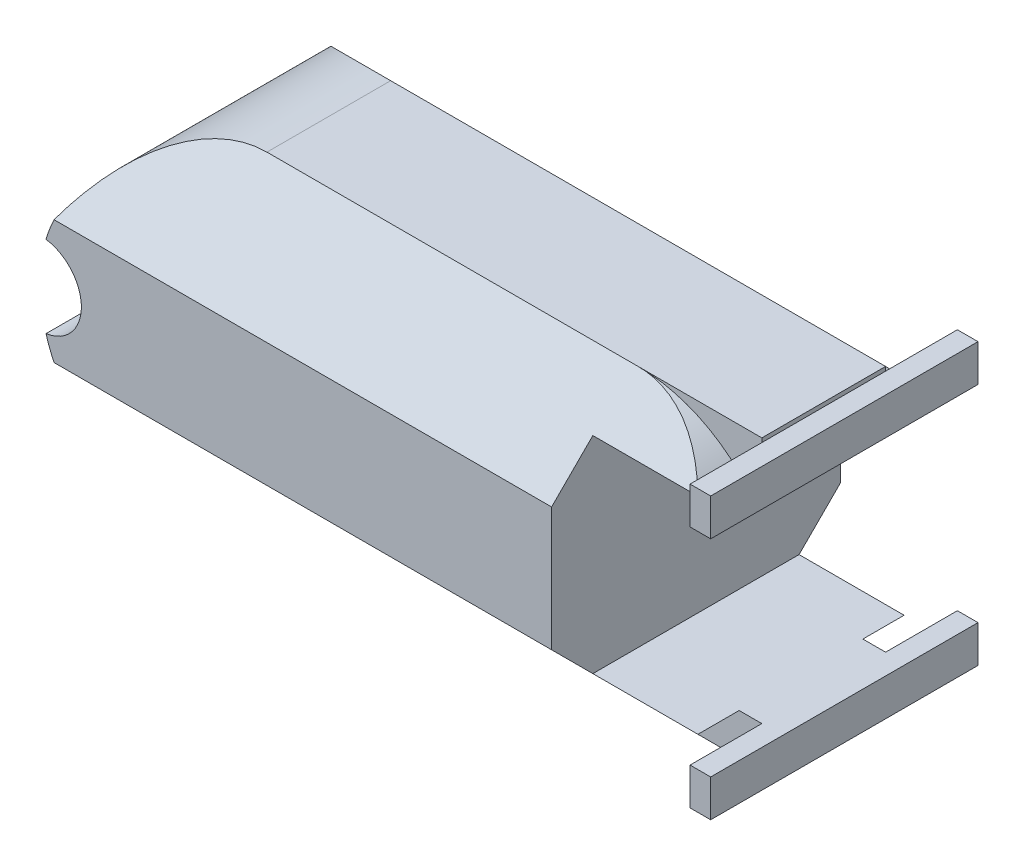
ISO-10303-21;
HEADER;
FILE_DESCRIPTION(('STEP AP214'),'2;1');
FILE_NAME('part.step','',(''),(''),'','','');
FILE_SCHEMA(('AUTOMOTIVE_DESIGN { 1 0 10303 214 1 1 1 1 }'));
ENDSEC;
DATA;
#1=APPLICATION_CONTEXT('core data for automotive mechanical design processes');
#2=APPLICATION_PROTOCOL_DEFINITION('international standard','automotive_design',2000,#1);
#3=PRODUCT_CONTEXT('',#1,'mechanical');
#4=PRODUCT('Part','Part','',(#3));
#5=PRODUCT_RELATED_PRODUCT_CATEGORY('part','',(#4));
#6=PRODUCT_DEFINITION_FORMATION('','',#4);
#7=PRODUCT_DEFINITION_CONTEXT('part definition',#1,'design');
#8=PRODUCT_DEFINITION('design','',#6,#7);
#9=PRODUCT_DEFINITION_SHAPE('','',#8);
#10=(LENGTH_UNIT() NAMED_UNIT(*) SI_UNIT(.MILLI.,.METRE.));
#11=(NAMED_UNIT(*) PLANE_ANGLE_UNIT() SI_UNIT($,.RADIAN.));
#12=(NAMED_UNIT(*) SI_UNIT($,.STERADIAN.) SOLID_ANGLE_UNIT());
#13=UNCERTAINTY_MEASURE_WITH_UNIT(LENGTH_MEASURE(1.E-05),#10,'distance_accuracy_value','');
#14=(GEOMETRIC_REPRESENTATION_CONTEXT(3) GLOBAL_UNCERTAINTY_ASSIGNED_CONTEXT((#13)) GLOBAL_UNIT_ASSIGNED_CONTEXT((#10,
#11,#12)) REPRESENTATION_CONTEXT('',''));
#15=CARTESIAN_POINT('',(0.,0.,0.));
#16=DIRECTION('',(0.,0.,1.));
#17=DIRECTION('',(1.,0.,0.));
#18=AXIS2_PLACEMENT_3D('',#15,#16,#17);
#19=CARTESIAN_POINT('',(0.,0.,35.));
#20=DIRECTION('',(0.,0.,1.));
#21=DIRECTION('',(1.,0.,0.));
#22=AXIS2_PLACEMENT_3D('',#19,#20,#21);
#23=PLANE('',#22);
#24=DIRECTION('',(1.,0.,0.));
#25=VECTOR('',#24,1.);
#26=CARTESIAN_POINT('',(22.5,-7.50000000000001,35.));
#27=LINE('',#26,#25);
#28=CARTESIAN_POINT('',(-38.3113883008419,-7.50000000000001,35.));
#29=VERTEX_POINT('',#28);
#30=CARTESIAN_POINT('',(22.0105159814593,-7.50000000000001,35.));
#31=VERTEX_POINT('',#30);
#32=EDGE_CURVE('E530',#29,#31,#27,.T.);
#33=ORIENTED_EDGE('',*,*,#32,.T.);
#34=DIRECTION('',(0.,-1.,0.));
#35=VECTOR('',#34,1.);
#36=CARTESIAN_POINT('',(22.0105159814593,12.5,35.));
#37=LINE('',#36,#35);
#38=CARTESIAN_POINT('',(22.0105159814593,7.49999999999999,35.));
#39=VERTEX_POINT('',#38);
#40=EDGE_CURVE('E408',#39,#31,#37,.T.);
#41=ORIENTED_EDGE('',*,*,#40,.F.);
#42=DIRECTION('',(-1.,0.,0.));
#43=VECTOR('',#42,1.);
#44=CARTESIAN_POINT('',(-22.5,7.49999999999999,35.));
#45=LINE('',#44,#43);
#46=CARTESIAN_POINT('',(-38.3113883008419,7.49999999999999,35.));
#47=VERTEX_POINT('',#46);
#48=EDGE_CURVE('E528',#39,#47,#45,.T.);
#49=ORIENTED_EDGE('',*,*,#48,.T.);
#50=CARTESIAN_POINT('',(-22.5,0.,35.));
#51=DIRECTION('',(0.,0.,1.));
#52=DIRECTION('',(1.,0.,0.));
#53=AXIS2_PLACEMENT_3D('',#50,#51,#52);
#54=CIRCLE('',#53,17.5);
#55=CARTESIAN_POINT('',(-39.2857142857143,4.94871659305392,35.));
#56=VERTEX_POINT('',#55);
#57=EDGE_CURVE('E543',#47,#56,#54,.T.);
#58=ORIENTED_EDGE('',*,*,#57,.T.);
#59=CARTESIAN_POINT('',(-40.,0.,35.));
#60=DIRECTION('',(0.,0.,1.));
#61=DIRECTION('',(1.,0.,0.));
#62=AXIS2_PLACEMENT_3D('',#59,#60,#61);
#63=CIRCLE('',#62,5.);
#64=CARTESIAN_POINT('',(-39.2857142857143,-4.94871659305394,35.));
#65=VERTEX_POINT('',#64);
#66=EDGE_CURVE('E554',#65,#56,#63,.T.);
#67=ORIENTED_EDGE('',*,*,#66,.F.);
#68=CARTESIAN_POINT('',(-22.5,0.,35.));
#69=DIRECTION('',(0.,0.,1.));
#70=DIRECTION('',(1.,0.,0.));
#71=AXIS2_PLACEMENT_3D('',#68,#69,#70);
#72=CIRCLE('',#71,17.5);
#73=EDGE_CURVE('E535',#65,#29,#72,.T.);
#74=ORIENTED_EDGE('',*,*,#73,.T.);
#75=EDGE_LOOP('',(#33,#41,#49,#58,#67,#74));
#76=FACE_BOUND('',#75,.T.);
#77=ADVANCED_FACE('F33',(#76),#23,.T.);
#78=CARTESIAN_POINT('',(0.,0.,0.));
#79=DIRECTION('',(0.,0.,1.));
#80=DIRECTION('',(1.,0.,0.));
#81=AXIS2_PLACEMENT_3D('',#78,#79,#80);
#82=PLANE('',#81);
#83=DIRECTION('',(0.,-1.,0.));
#84=VECTOR('',#83,1.);
#85=CARTESIAN_POINT('',(22.0105159814593,12.5,0.));
#86=LINE('',#85,#84);
#87=CARTESIAN_POINT('',(22.0105159814593,7.49999999999996,0.));
#88=VERTEX_POINT('',#87);
#89=CARTESIAN_POINT('',(22.0105159814593,-7.49999999999996,0.));
#90=VERTEX_POINT('',#89);
#91=EDGE_CURVE('E411',#88,#90,#86,.T.);
#92=ORIENTED_EDGE('',*,*,#91,.T.);
#93=DIRECTION('',(-1.,0.,0.));
#94=VECTOR('',#93,1.);
#95=CARTESIAN_POINT('',(0.,-7.49999999999997,0.));
#96=LINE('',#95,#94);
#97=CARTESIAN_POINT('',(-38.3113883008419,-7.49999999999996,0.));
#98=VERTEX_POINT('',#97);
#99=EDGE_CURVE('E480',#90,#98,#96,.T.);
#100=ORIENTED_EDGE('',*,*,#99,.T.);
#101=CARTESIAN_POINT('',(-22.5,0.,0.));
#102=DIRECTION('',(0.,0.,1.));
#103=DIRECTION('',(1.,0.,0.));
#104=AXIS2_PLACEMENT_3D('',#101,#102,#103);
#105=CIRCLE('',#104,17.5);
#106=CARTESIAN_POINT('',(-39.2857142857143,-4.94871659305394,0.));
#107=VERTEX_POINT('',#106);
#108=EDGE_CURVE('E538',#98,#107,#105,.F.);
#109=ORIENTED_EDGE('',*,*,#108,.T.);
#110=CARTESIAN_POINT('',(-40.,0.,0.));
#111=DIRECTION('',(0.,0.,1.));
#112=DIRECTION('',(1.,0.,0.));
#113=AXIS2_PLACEMENT_3D('',#110,#111,#112);
#114=CIRCLE('',#113,5.);
#115=CARTESIAN_POINT('',(-39.2857142857143,4.94871659305392,0.));
#116=VERTEX_POINT('',#115);
#117=EDGE_CURVE('E553',#107,#116,#114,.T.);
#118=ORIENTED_EDGE('',*,*,#117,.T.);
#119=CARTESIAN_POINT('',(-22.5,0.,0.));
#120=DIRECTION('',(0.,0.,1.));
#121=DIRECTION('',(1.,0.,0.));
#122=AXIS2_PLACEMENT_3D('',#119,#120,#121);
#123=CIRCLE('',#122,17.5);
#124=CARTESIAN_POINT('',(-38.3113883008419,7.49999999999996,0.));
#125=VERTEX_POINT('',#124);
#126=EDGE_CURVE('E548',#116,#125,#123,.F.);
#127=ORIENTED_EDGE('',*,*,#126,.T.);
#128=DIRECTION('',(1.,0.,0.));
#129=VECTOR('',#128,1.);
#130=CARTESIAN_POINT('',(0.,7.49999999999996,0.));
#131=LINE('',#130,#129);
#132=EDGE_CURVE('E478',#125,#88,#131,.T.);
#133=ORIENTED_EDGE('',*,*,#132,.T.);
#134=EDGE_LOOP('',(#92,#100,#109,#118,#127,#133));
#135=FACE_BOUND('',#134,.T.);
#136=ADVANCED_FACE('F574',(#135),#82,.F.);
#137=CARTESIAN_POINT('',(22.5,0.,35.));
#138=DIRECTION('',(0.,0.,-1.));
#139=DIRECTION('',(-1.,0.,0.));
#140=AXIS2_PLACEMENT_3D('',#137,#138,#139);
#141=CYLINDRICAL_SURFACE('',#140,17.5);
#142=CARTESIAN_POINT('',(22.5,0.,42.5));
#143=DIRECTION('',(0.,0.707106781186549,0.707106781186547));
#144=DIRECTION('',(0.,0.707106781186547,-0.707106781186549));
#145=AXIS2_PLACEMENT_3D('',#142,#143,#144);
#146=ELLIPSE('',#145,24.7487373415292,17.5);
#147=CARTESIAN_POINT('',(22.5,17.5,25.));
#148=VERTEX_POINT('',#147);
#149=CARTESIAN_POINT('',(34.7474487139159,12.5,30.));
#150=VERTEX_POINT('',#149);
#151=EDGE_CURVE('E469',#148,#150,#146,.F.);
#152=ORIENTED_EDGE('',*,*,#151,.T.);
#153=DIRECTION('',(0.,0.,-1.));
#154=VECTOR('',#153,1.);
#155=CARTESIAN_POINT('',(34.7474487139159,12.5,35.));
#156=LINE('',#155,#154);
#157=CARTESIAN_POINT('',(34.7474487139159,12.5,25.));
#158=VERTEX_POINT('',#157);
#159=EDGE_CURVE('E425',#150,#158,#156,.T.);
#160=ORIENTED_EDGE('',*,*,#159,.T.);
#161=CARTESIAN_POINT('',(22.5,0.,25.));
#162=DIRECTION('',(0.,0.,1.));
#163=DIRECTION('',(1.,0.,0.));
#164=AXIS2_PLACEMENT_3D('',#161,#162,#163);
#165=CIRCLE('',#164,17.5);
#166=EDGE_CURVE('E357',#148,#158,#165,.F.);
#167=ORIENTED_EDGE('',*,*,#166,.F.);
#168=EDGE_LOOP('',(#152,#160,#167));
#169=FACE_BOUND('',#168,.T.);
#170=ADVANCED_FACE('F565',(#169),#141,.T.);
#171=CARTESIAN_POINT('',(22.5,0.,10.));
#172=DIRECTION('',(0.,0.,-1.));
#173=DIRECTION('',(-1.,0.,0.));
#174=AXIS2_PLACEMENT_3D('',#171,#172,#173);
#175=CIRCLE('',#174,17.5);
#176=CARTESIAN_POINT('',(34.7474487139159,12.5,10.));
#177=VERTEX_POINT('',#176);
#178=CARTESIAN_POINT('',(22.5,17.5,10.));
#179=VERTEX_POINT('',#178);
#180=EDGE_CURVE('E341',#177,#179,#175,.F.);
#181=ORIENTED_EDGE('',*,*,#180,.F.);
#182=CARTESIAN_POINT('',(34.7474487139159,12.5,5.00000000000002));
#183=VERTEX_POINT('',#182);
#184=EDGE_CURVE('E421',#177,#183,#156,.T.);
#185=ORIENTED_EDGE('',*,*,#184,.T.);
#186=CARTESIAN_POINT('',(22.5,0.,-7.49999999999994));
#187=DIRECTION('',(0.,-0.707106781186547,0.707106781186549));
#188=DIRECTION('',(0.,-0.707106781186549,-0.707106781186547));
#189=AXIS2_PLACEMENT_3D('',#186,#187,#188);
#190=ELLIPSE('',#189,24.7487373415291,17.5);
#191=EDGE_CURVE('E514',#183,#179,#190,.T.);
#192=ORIENTED_EDGE('',*,*,#191,.T.);
#193=EDGE_LOOP('',(#181,#185,#192));
#194=FACE_BOUND('',#193,.T.);
#195=ADVANCED_FACE('F513',(#194),#141,.T.);
#196=CARTESIAN_POINT('',(22.5,0.,35.));
#197=DIRECTION('',(0.,0.,-1.));
#198=DIRECTION('',(-1.,0.,0.));
#199=AXIS2_PLACEMENT_3D('',#196,#197,#198);
#200=CYLINDRICAL_SURFACE('',#199,17.5);
#201=DIRECTION('',(0.,0.,-1.));
#202=VECTOR('',#201,1.);
#203=CARTESIAN_POINT('',(34.7474487139159,-12.5,35.));
#204=LINE('',#203,#202);
#205=CARTESIAN_POINT('',(34.7474487139159,-12.5,30.));
#206=VERTEX_POINT('',#205);
#207=CARTESIAN_POINT('',(34.7474487139159,-12.5,25.));
#208=VERTEX_POINT('',#207);
#209=EDGE_CURVE('E417',#206,#208,#204,.T.);
#210=ORIENTED_EDGE('',*,*,#209,.F.);
#211=CARTESIAN_POINT('',(22.5,0.,42.5));
#212=DIRECTION('',(0.,-0.707106781186549,0.707106781186546));
#213=DIRECTION('',(0.,-0.707106781186546,-0.707106781186549));
#214=AXIS2_PLACEMENT_3D('',#211,#212,#213);
#215=ELLIPSE('',#214,24.7487373415292,17.5);
#216=CARTESIAN_POINT('',(22.5,-17.5,25.));
#217=VERTEX_POINT('',#216);
#218=EDGE_CURVE('E461',#206,#217,#215,.F.);
#219=ORIENTED_EDGE('',*,*,#218,.T.);
#220=CARTESIAN_POINT('',(22.5,0.,25.));
#221=DIRECTION('',(0.,0.,1.));
#222=DIRECTION('',(1.,0.,0.));
#223=AXIS2_PLACEMENT_3D('',#220,#221,#222);
#224=CIRCLE('',#223,17.5);
#225=EDGE_CURVE('E302',#208,#217,#224,.F.);
#226=ORIENTED_EDGE('',*,*,#225,.F.);
#227=EDGE_LOOP('',(#210,#219,#226));
#228=FACE_BOUND('',#227,.T.);
#229=ADVANCED_FACE('F459',(#228),#200,.T.);
#230=CARTESIAN_POINT('',(0.,7.49999999999999,35.));
#231=DIRECTION('',(0.,0.707106781186549,0.707106781186547));
#232=DIRECTION('',(1.,0.,0.));
#233=AXIS2_PLACEMENT_3D('',#230,#231,#232);
#234=PLANE('',#233);
#235=ORIENTED_EDGE('',*,*,#48,.F.);
#236=DIRECTION('',(0.,0.707106781186547,-0.707106781186549));
#237=VECTOR('',#236,1.);
#238=CARTESIAN_POINT('',(22.0105159814593,7.49999999999999,35.));
#239=LINE('',#238,#237);
#240=CARTESIAN_POINT('',(22.0105159814593,12.5,30.));
#241=VERTEX_POINT('',#240);
#242=EDGE_CURVE('E437',#39,#241,#239,.T.);
#243=ORIENTED_EDGE('',*,*,#242,.T.);
#244=DIRECTION('',(1.,0.,0.));
#245=VECTOR('',#244,1.);
#246=CARTESIAN_POINT('',(0.,12.5,30.));
#247=LINE('',#246,#245);
#248=EDGE_CURVE('E428',#241,#150,#247,.T.);
#249=ORIENTED_EDGE('',*,*,#248,.T.);
#250=ORIENTED_EDGE('',*,*,#151,.F.);
#251=DIRECTION('',(1.,0.,0.));
#252=VECTOR('',#251,1.);
#253=CARTESIAN_POINT('',(22.5,17.5,25.));
#254=LINE('',#253,#252);
#255=CARTESIAN_POINT('',(-22.5,17.5,25.));
#256=VERTEX_POINT('',#255);
#257=EDGE_CURVE('E518',#256,#148,#254,.T.);
#258=ORIENTED_EDGE('',*,*,#257,.F.);
#259=CARTESIAN_POINT('',(-22.5,0.,42.5));
#260=DIRECTION('',(0.,0.707106781186549,0.707106781186547));
#261=DIRECTION('',(0.,0.707106781186547,-0.707106781186549));
#262=AXIS2_PLACEMENT_3D('',#259,#260,#261);
#263=ELLIPSE('',#262,24.7487373415292,17.5);
#264=EDGE_CURVE('E524',#47,#256,#263,.F.);
#265=ORIENTED_EDGE('',*,*,#264,.F.);
#266=EDGE_LOOP('',(#235,#243,#249,#250,#258,#265));
#267=FACE_BOUND('',#266,.T.);
#268=ADVANCED_FACE('F569',(#267),#234,.T.);
#269=CARTESIAN_POINT('',(0.,-7.50000000000001,35.));
#270=DIRECTION('',(0.,-0.707106781186549,0.707106781186546));
#271=DIRECTION('',(-1.,0.,0.));
#272=AXIS2_PLACEMENT_3D('',#269,#270,#271);
#273=PLANE('',#272);
#274=DIRECTION('',(1.,0.,0.));
#275=VECTOR('',#274,1.);
#276=CARTESIAN_POINT('',(0.,-12.5,30.));
#277=LINE('',#276,#275);
#278=CARTESIAN_POINT('',(22.0105159814593,-12.5,30.));
#279=VERTEX_POINT('',#278);
#280=EDGE_CURVE('E419',#279,#206,#277,.T.);
#281=ORIENTED_EDGE('',*,*,#280,.F.);
#282=DIRECTION('',(0.,0.707106781186546,0.707106781186549));
#283=VECTOR('',#282,1.);
#284=CARTESIAN_POINT('',(22.0105159814593,-7.50000000000001,35.));
#285=LINE('',#284,#283);
#286=EDGE_CURVE('E434',#279,#31,#285,.T.);
#287=ORIENTED_EDGE('',*,*,#286,.T.);
#288=ORIENTED_EDGE('',*,*,#32,.F.);
#289=CARTESIAN_POINT('',(-22.5,0.,42.5));
#290=DIRECTION('',(0.,-0.707106781186549,0.707106781186546));
#291=DIRECTION('',(0.,-0.707106781186546,-0.707106781186549));
#292=AXIS2_PLACEMENT_3D('',#289,#290,#291);
#293=ELLIPSE('',#292,24.7487373415292,17.5);
#294=CARTESIAN_POINT('',(-22.5,-17.5,25.));
#295=VERTEX_POINT('',#294);
#296=EDGE_CURVE('E476',#295,#29,#293,.F.);
#297=ORIENTED_EDGE('',*,*,#296,.F.);
#298=DIRECTION('',(-1.,0.,0.));
#299=VECTOR('',#298,1.);
#300=CARTESIAN_POINT('',(-22.5,-17.5,25.));
#301=LINE('',#300,#299);
#302=EDGE_CURVE('E466',#217,#295,#301,.T.);
#303=ORIENTED_EDGE('',*,*,#302,.F.);
#304=ORIENTED_EDGE('',*,*,#218,.F.);
#305=EDGE_LOOP('',(#281,#287,#288,#297,#303,#304));
#306=FACE_BOUND('',#305,.T.);
#307=ADVANCED_FACE('F588',(#306),#273,.T.);
#308=CARTESIAN_POINT('',(-40.,-17.5,10.));
#309=DIRECTION('',(0.,0.707106781186547,0.707106781186549));
#310=DIRECTION('',(1.,0.,0.));
#311=AXIS2_PLACEMENT_3D('',#308,#309,#310);
#312=PLANE('',#311);
#313=ORIENTED_EDGE('',*,*,#99,.F.);
#314=DIRECTION('',(0.,0.707106781186549,-0.707106781186547));
#315=VECTOR('',#314,1.);
#316=CARTESIAN_POINT('',(22.0105159814593,-17.5,10.));
#317=LINE('',#316,#315);
#318=CARTESIAN_POINT('',(22.0105159814593,-12.5,5.00000000000002));
#319=VERTEX_POINT('',#318);
#320=EDGE_CURVE('E431',#90,#319,#317,.F.);
#321=ORIENTED_EDGE('',*,*,#320,.T.);
#322=DIRECTION('',(1.,0.,0.));
#323=VECTOR('',#322,1.);
#324=CARTESIAN_POINT('',(-40.,-12.5,5.00000000000002));
#325=LINE('',#324,#323);
#326=CARTESIAN_POINT('',(34.7474487139159,-12.5,5.00000000000002));
#327=VERTEX_POINT('',#326);
#328=EDGE_CURVE('E416',#327,#319,#325,.F.);
#329=ORIENTED_EDGE('',*,*,#328,.F.);
#330=CARTESIAN_POINT('',(22.5,0.,-7.49999999999994));
#331=DIRECTION('',(0.,0.707106781186547,0.707106781186549));
#332=DIRECTION('',(0.,0.707106781186549,-0.707106781186547));
#333=AXIS2_PLACEMENT_3D('',#330,#331,#332);
#334=ELLIPSE('',#333,24.7487373415291,17.5);
#335=CARTESIAN_POINT('',(22.5,-17.5,10.));
#336=VERTEX_POINT('',#335);
#337=EDGE_CURVE('E464',#336,#327,#334,.T.);
#338=ORIENTED_EDGE('',*,*,#337,.F.);
#339=DIRECTION('',(1.,0.,0.));
#340=VECTOR('',#339,1.);
#341=CARTESIAN_POINT('',(-40.,-17.5,10.));
#342=LINE('',#341,#340);
#343=CARTESIAN_POINT('',(-22.5,-17.5,10.));
#344=VERTEX_POINT('',#343);
#345=EDGE_CURVE('E463',#344,#336,#342,.T.);
#346=ORIENTED_EDGE('',*,*,#345,.F.);
#347=CARTESIAN_POINT('',(-22.5,0.,-7.49999999999994));
#348=DIRECTION('',(0.,0.707106781186547,0.707106781186549));
#349=DIRECTION('',(0.,0.707106781186549,-0.707106781186547));
#350=AXIS2_PLACEMENT_3D('',#347,#348,#349);
#351=ELLIPSE('',#350,24.7487373415291,17.5);
#352=EDGE_CURVE('E474',#98,#344,#351,.T.);
#353=ORIENTED_EDGE('',*,*,#352,.F.);
#354=EDGE_LOOP('',(#313,#321,#329,#338,#346,#353));
#355=FACE_BOUND('',#354,.T.);
#356=ADVANCED_FACE('F577',(#355),#312,.F.);
#357=CARTESIAN_POINT('',(-40.,17.5,10.));
#358=DIRECTION('',(0.,-0.707106781186547,0.707106781186549));
#359=DIRECTION('',(-1.,0.,0.));
#360=AXIS2_PLACEMENT_3D('',#357,#358,#359);
#361=PLANE('',#360);
#362=DIRECTION('',(1.,0.,0.));
#363=VECTOR('',#362,1.);
#364=CARTESIAN_POINT('',(-40.,12.5,5.00000000000002));
#365=LINE('',#364,#363);
#366=CARTESIAN_POINT('',(22.0105159814593,12.5,5.00000000000002));
#367=VERTEX_POINT('',#366);
#368=EDGE_CURVE('E424',#183,#367,#365,.F.);
#369=ORIENTED_EDGE('',*,*,#368,.T.);
#370=DIRECTION('',(0.,0.707106781186549,0.707106781186547));
#371=VECTOR('',#370,1.);
#372=CARTESIAN_POINT('',(22.0105159814593,17.5,10.));
#373=LINE('',#372,#371);
#374=EDGE_CURVE('E342',#367,#88,#373,.F.);
#375=ORIENTED_EDGE('',*,*,#374,.T.);
#376=ORIENTED_EDGE('',*,*,#132,.F.);
#377=CARTESIAN_POINT('',(-22.5,0.,-7.49999999999994));
#378=DIRECTION('',(0.,-0.707106781186547,0.707106781186549));
#379=DIRECTION('',(0.,-0.707106781186549,-0.707106781186547));
#380=AXIS2_PLACEMENT_3D('',#377,#378,#379);
#381=ELLIPSE('',#380,24.7487373415291,17.5);
#382=CARTESIAN_POINT('',(-22.5,17.5,10.));
#383=VERTEX_POINT('',#382);
#384=EDGE_CURVE('E526',#383,#125,#381,.T.);
#385=ORIENTED_EDGE('',*,*,#384,.F.);
#386=DIRECTION('',(-1.,0.,0.));
#387=VECTOR('',#386,1.);
#388=CARTESIAN_POINT('',(-40.,17.5,10.));
#389=LINE('',#388,#387);
#390=EDGE_CURVE('E517',#179,#383,#389,.T.);
#391=ORIENTED_EDGE('',*,*,#390,.F.);
#392=ORIENTED_EDGE('',*,*,#191,.F.);
#393=EDGE_LOOP('',(#369,#375,#376,#385,#391,#392));
#394=FACE_BOUND('',#393,.T.);
#395=ADVANCED_FACE('F35',(#394),#361,.F.);
#396=CARTESIAN_POINT('',(-40.,17.5,35.));
#397=DIRECTION('',(0.,-1.,0.));
#398=DIRECTION('',(0.,0.,-1.));
#399=AXIS2_PLACEMENT_3D('',#396,#397,#398);
#400=PLANE('',#399);
#401=ORIENTED_EDGE('',*,*,#257,.T.);
#402=DIRECTION('',(1.,0.,0.));
#403=VECTOR('',#402,1.);
#404=CARTESIAN_POINT('',(0.,17.5,25.));
#405=LINE('',#404,#403);
#406=CARTESIAN_POINT('',(37.5,17.5,25.));
#407=VERTEX_POINT('',#406);
#408=EDGE_CURVE('E321',#148,#407,#405,.T.);
#409=ORIENTED_EDGE('',*,*,#408,.T.);
#410=DIRECTION('',(0.,0.,-1.));
#411=VECTOR('',#410,1.);
#412=CARTESIAN_POINT('',(37.5,17.5,10.));
#413=LINE('',#412,#411);
#414=CARTESIAN_POINT('',(37.5,17.5,10.));
#415=VERTEX_POINT('',#414);
#416=EDGE_CURVE('E324',#407,#415,#413,.T.);
#417=ORIENTED_EDGE('',*,*,#416,.T.);
#418=DIRECTION('',(-1.,0.,0.));
#419=VECTOR('',#418,1.);
#420=CARTESIAN_POINT('',(0.,17.5,10.));
#421=LINE('',#420,#419);
#422=EDGE_CURVE('E327',#415,#179,#421,.T.);
#423=ORIENTED_EDGE('',*,*,#422,.T.);
#424=ORIENTED_EDGE('',*,*,#390,.T.);
#425=DIRECTION('',(0.,0.,-1.));
#426=VECTOR('',#425,1.);
#427=CARTESIAN_POINT('',(-22.5,17.5,35.));
#428=LINE('',#427,#426);
#429=EDGE_CURVE('E545',#383,#256,#428,.F.);
#430=ORIENTED_EDGE('',*,*,#429,.T.);
#431=EDGE_LOOP('',(#401,#409,#417,#423,#424,#430));
#432=FACE_BOUND('',#431,.T.);
#433=ADVANCED_FACE('F560',(#432),#400,.F.);
#434=CARTESIAN_POINT('',(-40.,-17.5,35.));
#435=DIRECTION('',(0.,1.,0.));
#436=DIRECTION('',(0.,0.,1.));
#437=AXIS2_PLACEMENT_3D('',#434,#435,#436);
#438=PLANE('',#437);
#439=ORIENTED_EDGE('',*,*,#345,.T.);
#440=DIRECTION('',(1.,0.,0.));
#441=VECTOR('',#440,1.);
#442=CARTESIAN_POINT('',(0.,-17.5,10.));
#443=LINE('',#442,#441);
#444=CARTESIAN_POINT('',(37.5,-17.5,10.));
#445=VERTEX_POINT('',#444);
#446=EDGE_CURVE('E440',#336,#445,#443,.T.);
#447=ORIENTED_EDGE('',*,*,#446,.T.);
#448=DIRECTION('',(0.,0.,1.));
#449=VECTOR('',#448,1.);
#450=CARTESIAN_POINT('',(37.5,-17.5,25.));
#451=LINE('',#450,#449);
#452=CARTESIAN_POINT('',(37.5,-17.5,25.));
#453=VERTEX_POINT('',#452);
#454=EDGE_CURVE('E442',#445,#453,#451,.T.);
#455=ORIENTED_EDGE('',*,*,#454,.T.);
#456=DIRECTION('',(-1.,0.,0.));
#457=VECTOR('',#456,1.);
#458=CARTESIAN_POINT('',(0.,-17.5,25.));
#459=LINE('',#458,#457);
#460=EDGE_CURVE('E314',#453,#217,#459,.T.);
#461=ORIENTED_EDGE('',*,*,#460,.T.);
#462=ORIENTED_EDGE('',*,*,#302,.T.);
#463=DIRECTION('',(0.,0.,-1.));
#464=VECTOR('',#463,1.);
#465=CARTESIAN_POINT('',(-22.5,-17.5,35.));
#466=LINE('',#465,#464);
#467=EDGE_CURVE('E540',#295,#344,#466,.T.);
#468=ORIENTED_EDGE('',*,*,#467,.T.);
#469=EDGE_LOOP('',(#439,#447,#455,#461,#462,#468));
#470=FACE_BOUND('',#469,.T.);
#471=ADVANCED_FACE('F586',(#470),#438,.F.);
#472=CARTESIAN_POINT('',(-22.5,0.,35.));
#473=DIRECTION('',(0.,0.,-1.));
#474=DIRECTION('',(-1.,0.,0.));
#475=AXIS2_PLACEMENT_3D('',#472,#473,#474);
#476=CYLINDRICAL_SURFACE('',#475,17.5);
#477=ORIENTED_EDGE('',*,*,#57,.F.);
#478=ORIENTED_EDGE('',*,*,#264,.T.);
#479=ORIENTED_EDGE('',*,*,#429,.F.);
#480=ORIENTED_EDGE('',*,*,#384,.T.);
#481=ORIENTED_EDGE('',*,*,#126,.F.);
#482=DIRECTION('',(0.,0.,1.));
#483=VECTOR('',#482,1.);
#484=CARTESIAN_POINT('',(-39.2857142857143,4.94871659305392,17.5));
#485=LINE('',#484,#483);
#486=EDGE_CURVE('E551',#56,#116,#485,.F.);
#487=ORIENTED_EDGE('',*,*,#486,.F.);
#488=EDGE_LOOP('',(#477,#478,#479,#480,#481,#487));
#489=FACE_BOUND('',#488,.T.);
#490=ADVANCED_FACE('F600',(#489),#476,.T.);
#491=CARTESIAN_POINT('',(-22.5,0.,35.));
#492=DIRECTION('',(0.,0.,-1.));
#493=DIRECTION('',(-1.,0.,0.));
#494=AXIS2_PLACEMENT_3D('',#491,#492,#493);
#495=CYLINDRICAL_SURFACE('',#494,17.5);
#496=ORIENTED_EDGE('',*,*,#467,.F.);
#497=ORIENTED_EDGE('',*,*,#296,.T.);
#498=ORIENTED_EDGE('',*,*,#73,.F.);
#499=DIRECTION('',(0.,0.,1.));
#500=VECTOR('',#499,1.);
#501=CARTESIAN_POINT('',(-39.2857142857143,-4.94871659305394,17.5));
#502=LINE('',#501,#500);
#503=EDGE_CURVE('E533',#107,#65,#502,.T.);
#504=ORIENTED_EDGE('',*,*,#503,.F.);
#505=ORIENTED_EDGE('',*,*,#108,.F.);
#506=ORIENTED_EDGE('',*,*,#352,.T.);
#507=EDGE_LOOP('',(#496,#497,#498,#504,#505,#506));
#508=FACE_BOUND('',#507,.T.);
#509=ADVANCED_FACE('F583',(#508),#495,.T.);
#510=CARTESIAN_POINT('',(34.7474487139159,-12.5,10.));
#511=VERTEX_POINT('',#510);
#512=EDGE_CURVE('E414',#511,#327,#204,.T.);
#513=ORIENTED_EDGE('',*,*,#512,.F.);
#514=CARTESIAN_POINT('',(22.5,0.,10.));
#515=DIRECTION('',(0.,0.,-1.));
#516=DIRECTION('',(-1.,0.,0.));
#517=AXIS2_PLACEMENT_3D('',#514,#515,#516);
#518=CIRCLE('',#517,17.5);
#519=EDGE_CURVE('E298',#336,#511,#518,.F.);
#520=ORIENTED_EDGE('',*,*,#519,.F.);
#521=ORIENTED_EDGE('',*,*,#337,.T.);
#522=EDGE_LOOP('',(#513,#520,#521));
#523=FACE_BOUND('',#522,.T.);
#524=ADVANCED_FACE('F608',(#523),#200,.T.);
#525=CARTESIAN_POINT('',(-40.,0.,0.));
#526=DIRECTION('',(0.,0.,1.));
#527=DIRECTION('',(1.,0.,0.));
#528=AXIS2_PLACEMENT_3D('',#525,#526,#527);
#529=CYLINDRICAL_SURFACE('',#528,5.);
#530=ORIENTED_EDGE('',*,*,#486,.T.);
#531=ORIENTED_EDGE('',*,*,#117,.F.);
#532=ORIENTED_EDGE('',*,*,#503,.T.);
#533=ORIENTED_EDGE('',*,*,#66,.T.);
#534=EDGE_LOOP('',(#530,#531,#532,#533));
#535=FACE_BOUND('',#534,.T.);
#536=ADVANCED_FACE('F596',(#535),#529,.F.);
#537=CARTESIAN_POINT('',(0.,12.5,10.));
#538=DIRECTION('',(0.,0.,-1.));
#539=DIRECTION('',(-1.,0.,0.));
#540=AXIS2_PLACEMENT_3D('',#537,#538,#539);
#541=PLANE('',#540);
#542=DIRECTION('',(-1.,0.,0.));
#543=VECTOR('',#542,1.);
#544=CARTESIAN_POINT('',(0.,12.5,10.));
#545=LINE('',#544,#543);
#546=CARTESIAN_POINT('',(37.5,12.5,10.));
#547=VERTEX_POINT('',#546);
#548=EDGE_CURVE('E344',#547,#177,#545,.T.);
#549=ORIENTED_EDGE('',*,*,#548,.T.);
#550=ORIENTED_EDGE('',*,*,#180,.T.);
#551=ORIENTED_EDGE('',*,*,#422,.F.);
#552=DIRECTION('',(0.,1.,0.));
#553=VECTOR('',#552,1.);
#554=CARTESIAN_POINT('',(37.5,12.5,10.));
#555=LINE('',#554,#553);
#556=CARTESIAN_POINT('',(37.5,17.,10.));
#557=VERTEX_POINT('',#556);
#558=EDGE_CURVE('E331',#557,#415,#555,.T.);
#559=ORIENTED_EDGE('',*,*,#558,.F.);
#560=EDGE_CURVE('E333',#547,#557,#555,.T.);
#561=ORIENTED_EDGE('',*,*,#560,.F.);
#562=EDGE_LOOP('',(#549,#550,#551,#559,#561));
#563=FACE_BOUND('',#562,.T.);
#564=ADVANCED_FACE('F507',(#563),#541,.T.);
#565=CARTESIAN_POINT('',(37.5,12.5,10.));
#566=DIRECTION('',(1.,0.,0.));
#567=DIRECTION('',(0.,0.,-1.));
#568=AXIS2_PLACEMENT_3D('',#565,#566,#567);
#569=PLANE('',#568);
#570=DIRECTION('',(0.,0.,1.));
#571=VECTOR('',#570,1.);
#572=CARTESIAN_POINT('',(37.5,17.,33.704438216068));
#573=LINE('',#572,#571);
#574=CARTESIAN_POINT('',(37.5,17.,25.));
#575=VERTEX_POINT('',#574);
#576=EDGE_CURVE('E43',#557,#575,#573,.T.);
#577=ORIENTED_EDGE('',*,*,#576,.F.);
#578=ORIENTED_EDGE('',*,*,#558,.T.);
#579=ORIENTED_EDGE('',*,*,#416,.F.);
#580=DIRECTION('',(0.,1.,0.));
#581=VECTOR('',#580,1.);
#582=CARTESIAN_POINT('',(37.5,12.5,25.));
#583=LINE('',#582,#581);
#584=EDGE_CURVE('E334',#575,#407,#583,.T.);
#585=ORIENTED_EDGE('',*,*,#584,.F.);
#586=EDGE_LOOP('',(#577,#578,#579,#585));
#587=FACE_BOUND('',#586,.T.);
#588=ADVANCED_FACE('F562',(#587),#569,.T.);
#589=CARTESIAN_POINT('',(0.,12.5,25.));
#590=DIRECTION('',(0.,0.,1.));
#591=DIRECTION('',(1.,0.,0.));
#592=AXIS2_PLACEMENT_3D('',#589,#590,#591);
#593=PLANE('',#592);
#594=ORIENTED_EDGE('',*,*,#408,.F.);
#595=ORIENTED_EDGE('',*,*,#166,.T.);
#596=DIRECTION('',(1.,0.,0.));
#597=VECTOR('',#596,1.);
#598=CARTESIAN_POINT('',(0.,12.5,25.));
#599=LINE('',#598,#597);
#600=CARTESIAN_POINT('',(37.5,12.5,25.));
#601=VERTEX_POINT('',#600);
#602=EDGE_CURVE('E330',#158,#601,#599,.T.);
#603=ORIENTED_EDGE('',*,*,#602,.T.);
#604=EDGE_CURVE('E307',#601,#575,#583,.T.);
#605=ORIENTED_EDGE('',*,*,#604,.T.);
#606=ORIENTED_EDGE('',*,*,#584,.T.);
#607=EDGE_LOOP('',(#594,#595,#603,#605,#606));
#608=FACE_BOUND('',#607,.T.);
#609=ADVANCED_FACE('F355',(#608),#593,.T.);
#610=CARTESIAN_POINT('',(0.,12.5,0.));
#611=DIRECTION('',(0.,1.,0.));
#612=DIRECTION('',(0.,0.,1.));
#613=AXIS2_PLACEMENT_3D('',#610,#611,#612);
#614=PLANE('',#613);
#615=ORIENTED_EDGE('',*,*,#602,.F.);
#616=ORIENTED_EDGE('',*,*,#159,.F.);
#617=ORIENTED_EDGE('',*,*,#248,.F.);
#618=DIRECTION('',(0.,0.,1.));
#619=VECTOR('',#618,1.);
#620=CARTESIAN_POINT('',(22.0105159814593,12.5,0.));
#621=LINE('',#620,#619);
#622=EDGE_CURVE('E403',#367,#241,#621,.T.);
#623=ORIENTED_EDGE('',*,*,#622,.F.);
#624=ORIENTED_EDGE('',*,*,#368,.F.);
#625=ORIENTED_EDGE('',*,*,#184,.F.);
#626=ORIENTED_EDGE('',*,*,#548,.F.);
#627=DIRECTION('',(0.,0.,-1.));
#628=VECTOR('',#627,1.);
#629=CARTESIAN_POINT('',(37.5,12.5,33.704438216068));
#630=LINE('',#629,#628);
#631=CARTESIAN_POINT('',(37.5,12.5,1.29556178393203));
#632=VERTEX_POINT('',#631);
#633=EDGE_CURVE('E372',#547,#632,#630,.T.);
#634=ORIENTED_EDGE('',*,*,#633,.T.);
#635=DIRECTION('',(-1.,0.,0.));
#636=VECTOR('',#635,1.);
#637=CARTESIAN_POINT('',(40.,12.5,1.29556178393204));
#638=LINE('',#637,#636);
#639=CARTESIAN_POINT('',(40.,12.5,1.29556178393204));
#640=VERTEX_POINT('',#639);
#641=EDGE_CURVE('E387',#640,#632,#638,.T.);
#642=ORIENTED_EDGE('',*,*,#641,.F.);
#643=DIRECTION('',(0.,0.,-1.));
#644=VECTOR('',#643,1.);
#645=CARTESIAN_POINT('',(40.,12.5,33.704438216068));
#646=LINE('',#645,#644);
#647=CARTESIAN_POINT('',(40.,12.5,33.704438216068));
#648=VERTEX_POINT('',#647);
#649=EDGE_CURVE('E391',#648,#640,#646,.T.);
#650=ORIENTED_EDGE('',*,*,#649,.F.);
#651=DIRECTION('',(-1.,0.,0.));
#652=VECTOR('',#651,1.);
#653=CARTESIAN_POINT('',(40.,12.5,33.704438216068));
#654=LINE('',#653,#652);
#655=CARTESIAN_POINT('',(37.5,12.5,33.704438216068));
#656=VERTEX_POINT('',#655);
#657=EDGE_CURVE('E370',#648,#656,#654,.T.);
#658=ORIENTED_EDGE('',*,*,#657,.T.);
#659=EDGE_CURVE('E365',#656,#601,#630,.T.);
#660=ORIENTED_EDGE('',*,*,#659,.T.);
#661=EDGE_LOOP('',(#615,#616,#617,#623,#624,#625,#626,#634,#642,#650,#658,#660));
#662=FACE_BOUND('',#661,.T.);
#663=ADVANCED_FACE('F367',(#662),#614,.F.);
#664=CARTESIAN_POINT('',(0.,-12.5,25.));
#665=DIRECTION('',(0.,0.,1.));
#666=DIRECTION('',(1.,0.,0.));
#667=AXIS2_PLACEMENT_3D('',#664,#665,#666);
#668=PLANE('',#667);
#669=DIRECTION('',(-1.,0.,0.));
#670=VECTOR('',#669,1.);
#671=CARTESIAN_POINT('',(0.,-12.5,25.));
#672=LINE('',#671,#670);
#673=CARTESIAN_POINT('',(37.5,-12.5,25.));
#674=VERTEX_POINT('',#673);
#675=EDGE_CURVE('E310',#674,#208,#672,.T.);
#676=ORIENTED_EDGE('',*,*,#675,.T.);
#677=ORIENTED_EDGE('',*,*,#225,.T.);
#678=ORIENTED_EDGE('',*,*,#460,.F.);
#679=DIRECTION('',(0.,-1.,0.));
#680=VECTOR('',#679,1.);
#681=CARTESIAN_POINT('',(37.5,-12.5,25.));
#682=LINE('',#681,#680);
#683=CARTESIAN_POINT('',(37.5,-17.,25.));
#684=VERTEX_POINT('',#683);
#685=EDGE_CURVE('E299',#684,#453,#682,.T.);
#686=ORIENTED_EDGE('',*,*,#685,.F.);
#687=EDGE_CURVE('E294',#674,#684,#682,.T.);
#688=ORIENTED_EDGE('',*,*,#687,.F.);
#689=EDGE_LOOP('',(#676,#677,#678,#686,#688));
#690=FACE_BOUND('',#689,.T.);
#691=ADVANCED_FACE('F455',(#690),#668,.T.);
#692=CARTESIAN_POINT('',(37.5,-12.5,25.));
#693=DIRECTION('',(1.,0.,0.));
#694=DIRECTION('',(0.,0.,-1.));
#695=AXIS2_PLACEMENT_3D('',#692,#693,#694);
#696=PLANE('',#695);
#697=DIRECTION('',(0.,0.,-1.));
#698=VECTOR('',#697,1.);
#699=CARTESIAN_POINT('',(37.5,-17.,33.704438216068));
#700=LINE('',#699,#698);
#701=CARTESIAN_POINT('',(37.5,-17.,10.));
#702=VERTEX_POINT('',#701);
#703=EDGE_CURVE('E11',#684,#702,#700,.T.);
#704=ORIENTED_EDGE('',*,*,#703,.F.);
#705=ORIENTED_EDGE('',*,*,#685,.T.);
#706=ORIENTED_EDGE('',*,*,#454,.F.);
#707=DIRECTION('',(0.,-1.,0.));
#708=VECTOR('',#707,1.);
#709=CARTESIAN_POINT('',(37.5,-12.5,10.));
#710=LINE('',#709,#708);
#711=EDGE_CURVE('E316',#702,#445,#710,.T.);
#712=ORIENTED_EDGE('',*,*,#711,.F.);
#713=EDGE_LOOP('',(#704,#705,#706,#712));
#714=FACE_BOUND('',#713,.T.);
#715=ADVANCED_FACE('F723',(#714),#696,.T.);
#716=CARTESIAN_POINT('',(0.,-12.5,10.));
#717=DIRECTION('',(0.,0.,-1.));
#718=DIRECTION('',(-1.,0.,0.));
#719=AXIS2_PLACEMENT_3D('',#716,#717,#718);
#720=PLANE('',#719);
#721=ORIENTED_EDGE('',*,*,#446,.F.);
#722=ORIENTED_EDGE('',*,*,#519,.T.);
#723=DIRECTION('',(1.,0.,0.));
#724=VECTOR('',#723,1.);
#725=CARTESIAN_POINT('',(0.,-12.5,10.));
#726=LINE('',#725,#724);
#727=CARTESIAN_POINT('',(37.5,-12.5,10.));
#728=VERTEX_POINT('',#727);
#729=EDGE_CURVE('E448',#511,#728,#726,.T.);
#730=ORIENTED_EDGE('',*,*,#729,.T.);
#731=EDGE_CURVE('E37',#728,#702,#710,.T.);
#732=ORIENTED_EDGE('',*,*,#731,.T.);
#733=ORIENTED_EDGE('',*,*,#711,.T.);
#734=EDGE_LOOP('',(#721,#722,#730,#732,#733));
#735=FACE_BOUND('',#734,.T.);
#736=ADVANCED_FACE('F729',(#735),#720,.T.);
#737=CARTESIAN_POINT('',(0.,-12.5,0.));
#738=DIRECTION('',(0.,-1.,0.));
#739=DIRECTION('',(0.,0.,-1.));
#740=AXIS2_PLACEMENT_3D('',#737,#738,#739);
#741=PLANE('',#740);
#742=ORIENTED_EDGE('',*,*,#729,.F.);
#743=ORIENTED_EDGE('',*,*,#512,.T.);
#744=ORIENTED_EDGE('',*,*,#328,.T.);
#745=DIRECTION('',(0.,0.,1.));
#746=VECTOR('',#745,1.);
#747=CARTESIAN_POINT('',(22.0105159814593,-12.5,0.));
#748=LINE('',#747,#746);
#749=EDGE_CURVE('E398',#319,#279,#748,.T.);
#750=ORIENTED_EDGE('',*,*,#749,.T.);
#751=ORIENTED_EDGE('',*,*,#280,.T.);
#752=ORIENTED_EDGE('',*,*,#209,.T.);
#753=ORIENTED_EDGE('',*,*,#675,.F.);
#754=DIRECTION('',(0.,0.,1.));
#755=VECTOR('',#754,1.);
#756=CARTESIAN_POINT('',(37.5,-12.5,33.704438216068));
#757=LINE('',#756,#755);
#758=CARTESIAN_POINT('',(37.5,-12.5,33.704438216068));
#759=VERTEX_POINT('',#758);
#760=EDGE_CURVE('E273',#674,#759,#757,.T.);
#761=ORIENTED_EDGE('',*,*,#760,.T.);
#762=DIRECTION('',(-1.,0.,0.));
#763=VECTOR('',#762,1.);
#764=CARTESIAN_POINT('',(40.,-12.5,33.704438216068));
#765=LINE('',#764,#763);
#766=CARTESIAN_POINT('',(40.,-12.5,33.704438216068));
#767=VERTEX_POINT('',#766);
#768=EDGE_CURVE('E243',#767,#759,#765,.T.);
#769=ORIENTED_EDGE('',*,*,#768,.F.);
#770=DIRECTION('',(0.,0.,1.));
#771=VECTOR('',#770,1.);
#772=CARTESIAN_POINT('',(40.,-12.5,33.704438216068));
#773=LINE('',#772,#771);
#774=CARTESIAN_POINT('',(40.,-12.5,1.29556178393202));
#775=VERTEX_POINT('',#774);
#776=EDGE_CURVE('E234',#775,#767,#773,.T.);
#777=ORIENTED_EDGE('',*,*,#776,.F.);
#778=DIRECTION('',(-1.,0.,0.));
#779=VECTOR('',#778,1.);
#780=CARTESIAN_POINT('',(40.,-12.5,1.29556178393202));
#781=LINE('',#780,#779);
#782=CARTESIAN_POINT('',(37.5,-12.5,1.29556178393201));
#783=VERTEX_POINT('',#782);
#784=EDGE_CURVE('E240',#775,#783,#781,.T.);
#785=ORIENTED_EDGE('',*,*,#784,.T.);
#786=EDGE_CURVE('E269',#783,#728,#757,.T.);
#787=ORIENTED_EDGE('',*,*,#786,.T.);
#788=EDGE_LOOP('',(#742,#743,#744,#750,#751,#752,#753,#761,#769,#777,#785,#787));
#789=FACE_BOUND('',#788,.T.);
#790=ADVANCED_FACE('F237',(#789),#741,.F.);
#791=CARTESIAN_POINT('',(22.0105159814593,12.5,0.));
#792=DIRECTION('',(1.,0.,0.));
#793=DIRECTION('',(0.,0.,-1.));
#794=AXIS2_PLACEMENT_3D('',#791,#792,#793);
#795=PLANE('',#794);
#796=ORIENTED_EDGE('',*,*,#40,.T.);
#797=ORIENTED_EDGE('',*,*,#286,.F.);
#798=ORIENTED_EDGE('',*,*,#749,.F.);
#799=ORIENTED_EDGE('',*,*,#320,.F.);
#800=ORIENTED_EDGE('',*,*,#91,.F.);
#801=ORIENTED_EDGE('',*,*,#374,.F.);
#802=ORIENTED_EDGE('',*,*,#622,.T.);
#803=ORIENTED_EDGE('',*,*,#242,.F.);
#804=EDGE_LOOP('',(#796,#797,#798,#799,#800,#801,#802,#803));
#805=FACE_BOUND('',#804,.T.);
#806=ADVANCED_FACE('F572',(#805),#795,.T.);
#807=CARTESIAN_POINT('',(37.5,0.,0.));
#808=DIRECTION('',(1.,0.,0.));
#809=DIRECTION('',(0.,0.,-1.));
#810=AXIS2_PLACEMENT_3D('',#807,#808,#809);
#811=PLANE('',#810);
#812=ORIENTED_EDGE('',*,*,#633,.F.);
#813=ORIENTED_EDGE('',*,*,#560,.T.);
#814=CARTESIAN_POINT('',(37.5,17.,1.29556178393203));
#815=VERTEX_POINT('',#814);
#816=EDGE_CURVE('E488',#815,#557,#573,.T.);
#817=ORIENTED_EDGE('',*,*,#816,.F.);
#818=DIRECTION('',(0.,1.,0.));
#819=VECTOR('',#818,1.);
#820=CARTESIAN_POINT('',(37.5,17.,1.29556178393203));
#821=LINE('',#820,#819);
#822=EDGE_CURVE('E260',#632,#815,#821,.T.);
#823=ORIENTED_EDGE('',*,*,#822,.F.);
#824=EDGE_LOOP('',(#812,#813,#817,#823));
#825=FACE_BOUND('',#824,.T.);
#826=ADVANCED_FACE('F504',(#825),#811,.F.);
#827=CARTESIAN_POINT('',(40.,17.,1.29556178393204));
#828=DIRECTION('',(0.,0.,1.));
#829=DIRECTION('',(1.,0.,0.));
#830=AXIS2_PLACEMENT_3D('',#827,#828,#829);
#831=PLANE('',#830);
#832=ORIENTED_EDGE('',*,*,#822,.T.);
#833=DIRECTION('',(-1.,0.,0.));
#834=VECTOR('',#833,1.);
#835=CARTESIAN_POINT('',(40.,17.,1.29556178393204));
#836=LINE('',#835,#834);
#837=CARTESIAN_POINT('',(40.,17.,1.29556178393204));
#838=VERTEX_POINT('',#837);
#839=EDGE_CURVE('E380',#838,#815,#836,.T.);
#840=ORIENTED_EDGE('',*,*,#839,.F.);
#841=DIRECTION('',(0.,1.,0.));
#842=VECTOR('',#841,1.);
#843=CARTESIAN_POINT('',(40.,17.,1.29556178393204));
#844=LINE('',#843,#842);
#845=EDGE_CURVE('E371',#640,#838,#844,.T.);
#846=ORIENTED_EDGE('',*,*,#845,.F.);
#847=ORIENTED_EDGE('',*,*,#641,.T.);
#848=EDGE_LOOP('',(#832,#840,#846,#847));
#849=FACE_BOUND('',#848,.T.);
#850=ADVANCED_FACE('F500',(#849),#831,.F.);
#851=CARTESIAN_POINT('',(40.,17.,33.704438216068));
#852=DIRECTION('',(0.,-1.,0.));
#853=DIRECTION('',(0.,0.,-1.));
#854=AXIS2_PLACEMENT_3D('',#851,#852,#853);
#855=PLANE('',#854);
#856=ORIENTED_EDGE('',*,*,#816,.T.);
#857=ORIENTED_EDGE('',*,*,#576,.T.);
#858=CARTESIAN_POINT('',(37.5,17.,33.704438216068));
#859=VERTEX_POINT('',#858);
#860=EDGE_CURVE('E263',#575,#859,#573,.T.);
#861=ORIENTED_EDGE('',*,*,#860,.T.);
#862=DIRECTION('',(-1.,0.,0.));
#863=VECTOR('',#862,1.);
#864=CARTESIAN_POINT('',(40.,17.,33.704438216068));
#865=LINE('',#864,#863);
#866=CARTESIAN_POINT('',(40.,17.,33.704438216068));
#867=VERTEX_POINT('',#866);
#868=EDGE_CURVE('E392',#867,#859,#865,.T.);
#869=ORIENTED_EDGE('',*,*,#868,.F.);
#870=DIRECTION('',(0.,0.,1.));
#871=VECTOR('',#870,1.);
#872=CARTESIAN_POINT('',(40.,17.,33.704438216068));
#873=LINE('',#872,#871);
#874=EDGE_CURVE('E375',#838,#867,#873,.T.);
#875=ORIENTED_EDGE('',*,*,#874,.F.);
#876=ORIENTED_EDGE('',*,*,#839,.T.);
#877=EDGE_LOOP('',(#856,#857,#861,#869,#875,#876));
#878=FACE_BOUND('',#877,.T.);
#879=ADVANCED_FACE('F489',(#878),#855,.F.);
#880=CARTESIAN_POINT('',(40.,17.,33.704438216068));
#881=DIRECTION('',(0.,0.,-1.));
#882=DIRECTION('',(-1.,0.,0.));
#883=AXIS2_PLACEMENT_3D('',#880,#881,#882);
#884=PLANE('',#883);
#885=DIRECTION('',(0.,-1.,0.));
#886=VECTOR('',#885,1.);
#887=CARTESIAN_POINT('',(37.5,17.,33.704438216068));
#888=LINE('',#887,#886);
#889=EDGE_CURVE('E376',#859,#656,#888,.T.);
#890=ORIENTED_EDGE('',*,*,#889,.T.);
#891=ORIENTED_EDGE('',*,*,#657,.F.);
#892=DIRECTION('',(0.,-1.,0.));
#893=VECTOR('',#892,1.);
#894=CARTESIAN_POINT('',(40.,17.,33.704438216068));
#895=LINE('',#894,#893);
#896=EDGE_CURVE('E490',#867,#648,#895,.T.);
#897=ORIENTED_EDGE('',*,*,#896,.F.);
#898=ORIENTED_EDGE('',*,*,#868,.T.);
#899=EDGE_LOOP('',(#890,#891,#897,#898));
#900=FACE_BOUND('',#899,.T.);
#901=ADVANCED_FACE('F491',(#900),#884,.F.);
#902=CARTESIAN_POINT('',(40.,0.,0.));
#903=DIRECTION('',(1.,0.,0.));
#904=DIRECTION('',(0.,0.,-1.));
#905=AXIS2_PLACEMENT_3D('',#902,#903,#904);
#906=PLANE('',#905);
#907=ORIENTED_EDGE('',*,*,#845,.T.);
#908=ORIENTED_EDGE('',*,*,#874,.T.);
#909=ORIENTED_EDGE('',*,*,#896,.T.);
#910=ORIENTED_EDGE('',*,*,#649,.T.);
#911=EDGE_LOOP('',(#907,#908,#909,#910));
#912=FACE_BOUND('',#911,.T.);
#913=ADVANCED_FACE('F496',(#912),#906,.T.);
#914=ORIENTED_EDGE('',*,*,#604,.F.);
#915=ORIENTED_EDGE('',*,*,#659,.F.);
#916=ORIENTED_EDGE('',*,*,#889,.F.);
#917=ORIENTED_EDGE('',*,*,#860,.F.);
#918=EDGE_LOOP('',(#914,#915,#916,#917));
#919=FACE_BOUND('',#918,.T.);
#920=ADVANCED_FACE('F363',(#919),#811,.F.);
#921=CARTESIAN_POINT('',(37.5,0.,0.));
#922=DIRECTION('',(1.,0.,0.));
#923=DIRECTION('',(0.,0.,-1.));
#924=AXIS2_PLACEMENT_3D('',#921,#922,#923);
#925=PLANE('',#924);
#926=ORIENTED_EDGE('',*,*,#760,.F.);
#927=ORIENTED_EDGE('',*,*,#687,.T.);
#928=CARTESIAN_POINT('',(37.5,-17.,33.704438216068));
#929=VERTEX_POINT('',#928);
#930=EDGE_CURVE('E45',#929,#684,#700,.T.);
#931=ORIENTED_EDGE('',*,*,#930,.F.);
#932=DIRECTION('',(0.,-1.,0.));
#933=VECTOR('',#932,1.);
#934=CARTESIAN_POINT('',(37.5,-12.5,33.704438216068));
#935=LINE('',#934,#933);
#936=EDGE_CURVE('E272',#759,#929,#935,.T.);
#937=ORIENTED_EDGE('',*,*,#936,.F.);
#938=EDGE_LOOP('',(#926,#927,#931,#937));
#939=FACE_BOUND('',#938,.T.);
#940=ADVANCED_FACE('F293',(#939),#925,.F.);
#941=CARTESIAN_POINT('',(40.,-12.5,1.29556178393202));
#942=DIRECTION('',(0.,0.,1.));
#943=DIRECTION('',(1.,0.,0.));
#944=AXIS2_PLACEMENT_3D('',#941,#942,#943);
#945=PLANE('',#944);
#946=DIRECTION('',(0.,1.,0.));
#947=VECTOR('',#946,1.);
#948=CARTESIAN_POINT('',(37.5,-12.5,1.29556178393201));
#949=LINE('',#948,#947);
#950=CARTESIAN_POINT('',(37.5,-17.,1.29556178393201));
#951=VERTEX_POINT('',#950);
#952=EDGE_CURVE('E259',#951,#783,#949,.T.);
#953=ORIENTED_EDGE('',*,*,#952,.T.);
#954=ORIENTED_EDGE('',*,*,#784,.F.);
#955=DIRECTION('',(0.,1.,0.));
#956=VECTOR('',#955,1.);
#957=CARTESIAN_POINT('',(40.,-12.5,1.29556178393202));
#958=LINE('',#957,#956);
#959=CARTESIAN_POINT('',(40.,-17.,1.29556178393201));
#960=VERTEX_POINT('',#959);
#961=EDGE_CURVE('E247',#960,#775,#958,.T.);
#962=ORIENTED_EDGE('',*,*,#961,.F.);
#963=DIRECTION('',(-1.,0.,0.));
#964=VECTOR('',#963,1.);
#965=CARTESIAN_POINT('',(40.,-17.,1.29556178393201));
#966=LINE('',#965,#964);
#967=EDGE_CURVE('E282',#960,#951,#966,.T.);
#968=ORIENTED_EDGE('',*,*,#967,.T.);
#969=EDGE_LOOP('',(#953,#954,#962,#968));
#970=FACE_BOUND('',#969,.T.);
#971=ADVANCED_FACE('F257',(#970),#945,.F.);
#972=CARTESIAN_POINT('',(40.,-12.5,33.704438216068));
#973=DIRECTION('',(0.,0.,-1.));
#974=DIRECTION('',(-1.,0.,0.));
#975=AXIS2_PLACEMENT_3D('',#972,#973,#974);
#976=PLANE('',#975);
#977=ORIENTED_EDGE('',*,*,#936,.T.);
#978=DIRECTION('',(-1.,0.,0.));
#979=VECTOR('',#978,1.);
#980=CARTESIAN_POINT('',(40.,-17.,33.704438216068));
#981=LINE('',#980,#979);
#982=CARTESIAN_POINT('',(40.,-17.,33.704438216068));
#983=VERTEX_POINT('',#982);
#984=EDGE_CURVE('E265',#983,#929,#981,.T.);
#985=ORIENTED_EDGE('',*,*,#984,.F.);
#986=DIRECTION('',(0.,-1.,0.));
#987=VECTOR('',#986,1.);
#988=CARTESIAN_POINT('',(40.,-12.5,33.704438216068));
#989=LINE('',#988,#987);
#990=EDGE_CURVE('E246',#767,#983,#989,.T.);
#991=ORIENTED_EDGE('',*,*,#990,.F.);
#992=ORIENTED_EDGE('',*,*,#768,.T.);
#993=EDGE_LOOP('',(#977,#985,#991,#992));
#994=FACE_BOUND('',#993,.T.);
#995=ADVANCED_FACE('F795',(#994),#976,.F.);
#996=CARTESIAN_POINT('',(40.,-17.,33.704438216068));
#997=DIRECTION('',(0.,1.,0.));
#998=DIRECTION('',(0.,0.,1.));
#999=AXIS2_PLACEMENT_3D('',#996,#997,#998);
#1000=PLANE('',#999);
#1001=ORIENTED_EDGE('',*,*,#930,.T.);
#1002=ORIENTED_EDGE('',*,*,#703,.T.);
#1003=EDGE_CURVE('E46',#702,#951,#700,.T.);
#1004=ORIENTED_EDGE('',*,*,#1003,.T.);
#1005=ORIENTED_EDGE('',*,*,#967,.F.);
#1006=DIRECTION('',(0.,0.,-1.));
#1007=VECTOR('',#1006,1.);
#1008=CARTESIAN_POINT('',(40.,-17.,33.704438216068));
#1009=LINE('',#1008,#1007);
#1010=EDGE_CURVE('E252',#983,#960,#1009,.T.);
#1011=ORIENTED_EDGE('',*,*,#1010,.F.);
#1012=ORIENTED_EDGE('',*,*,#984,.T.);
#1013=EDGE_LOOP('',(#1001,#1002,#1004,#1005,#1011,#1012));
#1014=FACE_BOUND('',#1013,.T.);
#1015=ADVANCED_FACE('F287',(#1014),#1000,.F.);
#1016=CARTESIAN_POINT('',(40.,0.,0.));
#1017=DIRECTION('',(1.,0.,0.));
#1018=DIRECTION('',(0.,0.,-1.));
#1019=AXIS2_PLACEMENT_3D('',#1016,#1017,#1018);
#1020=PLANE('',#1019);
#1021=ORIENTED_EDGE('',*,*,#961,.T.);
#1022=ORIENTED_EDGE('',*,*,#776,.T.);
#1023=ORIENTED_EDGE('',*,*,#990,.T.);
#1024=ORIENTED_EDGE('',*,*,#1010,.T.);
#1025=EDGE_LOOP('',(#1021,#1022,#1023,#1024));
#1026=FACE_BOUND('',#1025,.T.);
#1027=ADVANCED_FACE('F250',(#1026),#1020,.T.);
#1028=ORIENTED_EDGE('',*,*,#731,.F.);
#1029=ORIENTED_EDGE('',*,*,#786,.F.);
#1030=ORIENTED_EDGE('',*,*,#952,.F.);
#1031=ORIENTED_EDGE('',*,*,#1003,.F.);
#1032=EDGE_LOOP('',(#1028,#1029,#1030,#1031));
#1033=FACE_BOUND('',#1032,.T.);
#1034=ADVANCED_FACE('F789',(#1033),#925,.F.);
#1035=CLOSED_SHELL('',(#77,#136,#170,#195,#229,#268,#307,#356,#395,#433,#471,#490,#509,#524,
#536,#564,#588,#609,#663,#691,#715,#736,#790,#806,#826,#850,#879,#901,#913,#920,#940,#971,#995,
#1015,#1027,#1034));
#1036=MANIFOLD_SOLID_BREP('B2',#1035);
#1037=ADVANCED_BREP_SHAPE_REPRESENTATION('',(#18,#1036),#14);
#1038=SHAPE_DEFINITION_REPRESENTATION(#9,#1037);
ENDSEC;
END-ISO-10303-21;
